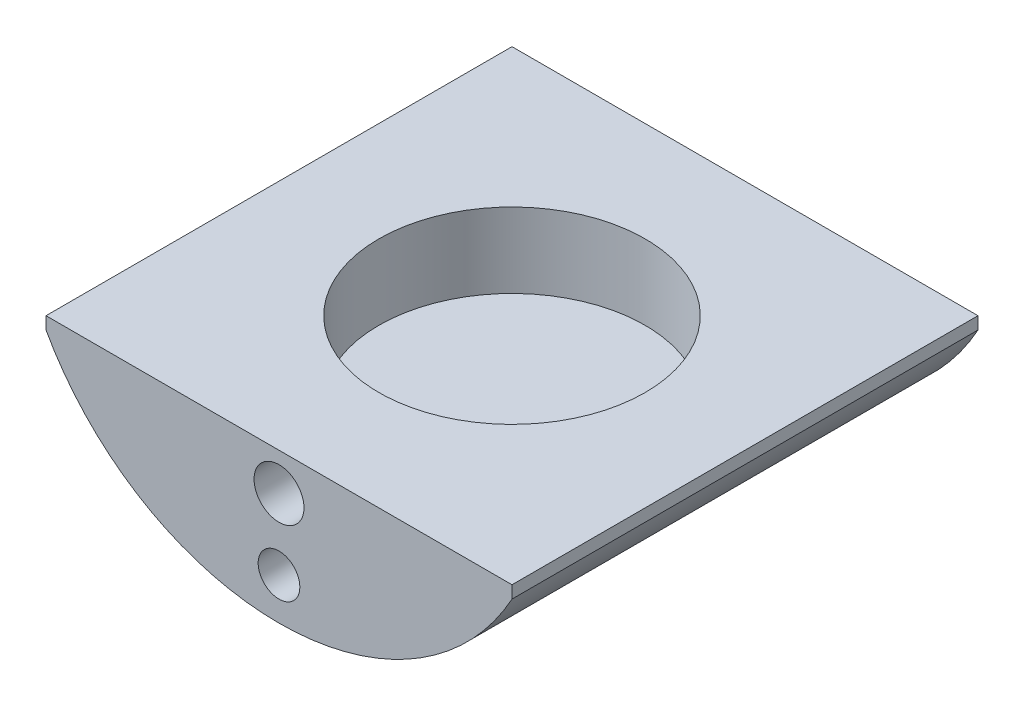
ISO-10303-21;
HEADER;
FILE_DESCRIPTION(('STEP AP214'),'2;1');
FILE_NAME('part.step','',(''),(''),'','','');
FILE_SCHEMA(('AUTOMOTIVE_DESIGN { 1 0 10303 214 1 1 1 1 }'));
ENDSEC;
DATA;
#1=APPLICATION_CONTEXT('core data for automotive mechanical design processes');
#2=APPLICATION_PROTOCOL_DEFINITION('international standard','automotive_design',2000,#1);
#3=PRODUCT_CONTEXT('',#1,'mechanical');
#4=PRODUCT('Part','Part','',(#3));
#5=PRODUCT_RELATED_PRODUCT_CATEGORY('part','',(#4));
#6=PRODUCT_DEFINITION_FORMATION('','',#4);
#7=PRODUCT_DEFINITION_CONTEXT('part definition',#1,'design');
#8=PRODUCT_DEFINITION('design','',#6,#7);
#9=PRODUCT_DEFINITION_SHAPE('','',#8);
#10=(LENGTH_UNIT() NAMED_UNIT(*) SI_UNIT(.MILLI.,.METRE.));
#11=(NAMED_UNIT(*) PLANE_ANGLE_UNIT() SI_UNIT($,.RADIAN.));
#12=(NAMED_UNIT(*) SI_UNIT($,.STERADIAN.) SOLID_ANGLE_UNIT());
#13=UNCERTAINTY_MEASURE_WITH_UNIT(LENGTH_MEASURE(1.E-05),#10,'distance_accuracy_value','');
#14=(GEOMETRIC_REPRESENTATION_CONTEXT(3) GLOBAL_UNCERTAINTY_ASSIGNED_CONTEXT((#13)) GLOBAL_UNIT_ASSIGNED_CONTEXT((#10,
#11,#12)) REPRESENTATION_CONTEXT('',''));
#15=CARTESIAN_POINT('',(0.,0.,0.));
#16=DIRECTION('',(0.,0.,1.));
#17=DIRECTION('',(1.,0.,0.));
#18=AXIS2_PLACEMENT_3D('',#15,#16,#17);
#19=CARTESIAN_POINT('',(0.,22.225,-44.45));
#20=DIRECTION('',(0.,0.,1.));
#21=DIRECTION('',(1.,0.,0.));
#22=AXIS2_PLACEMENT_3D('',#19,#20,#21);
#23=PLANE('',#22);
#24=CARTESIAN_POINT('',(0.,-7.14375,-44.45));
#25=DIRECTION('',(0.,0.,1.));
#26=DIRECTION('',(1.,0.,0.));
#27=AXIS2_PLACEMENT_3D('',#24,#25,#26);
#28=CIRCLE('',#27,4.7625);
#29=CARTESIAN_POINT('',(4.7625,-7.14375,-44.45));
#30=VERTEX_POINT('',#29);
#31=EDGE_CURVE('E263',#30,#30,#28,.T.);
#32=ORIENTED_EDGE('',*,*,#31,.T.);
#33=EDGE_LOOP('',(#32));
#34=FACE_BOUND('',#33,.T.);
#35=DIRECTION('',(0.,-1.,0.));
#36=VECTOR('',#35,1.);
#37=CARTESIAN_POINT('',(-44.45,0.,-44.45));
#38=LINE('',#37,#36);
#39=CARTESIAN_POINT('',(-44.45,0.,-44.45));
#40=VERTEX_POINT('',#39);
#41=CARTESIAN_POINT('',(-44.45,-2.36844424841707,-44.45));
#42=VERTEX_POINT('',#41);
#43=EDGE_CURVE('E92',#40,#42,#38,.T.);
#44=ORIENTED_EDGE('',*,*,#43,.F.);
#45=DIRECTION('',(1.,0.,0.));
#46=VECTOR('',#45,1.);
#47=CARTESIAN_POINT('',(-44.45,0.,-44.45));
#48=LINE('',#47,#46);
#49=CARTESIAN_POINT('',(44.45,0.,-44.45));
#50=VERTEX_POINT('',#49);
#51=EDGE_CURVE('E89',#40,#50,#48,.T.);
#52=ORIENTED_EDGE('',*,*,#51,.T.);
#53=DIRECTION('',(0.,1.,0.));
#54=VECTOR('',#53,1.);
#55=CARTESIAN_POINT('',(44.45,-2.3684442484171,-44.45));
#56=LINE('',#55,#54);
#57=CARTESIAN_POINT('',(44.45,-2.3684442484171,-44.45));
#58=VERTEX_POINT('',#57);
#59=EDGE_CURVE('E81',#58,#50,#56,.T.);
#60=ORIENTED_EDGE('',*,*,#59,.F.);
#61=CARTESIAN_POINT('',(0.,22.225,-44.45));
#62=DIRECTION('',(0.,0.,1.));
#63=DIRECTION('',(1.,0.,0.));
#64=AXIS2_PLACEMENT_3D('',#61,#62,#63);
#65=CIRCLE('',#64,50.8);
#66=EDGE_CURVE('E88',#42,#58,#65,.T.);
#67=ORIENTED_EDGE('',*,*,#66,.F.);
#68=EDGE_LOOP('',(#44,#52,#60,#67));
#69=FACE_BOUND('',#68,.T.);
#70=CARTESIAN_POINT('',(0.,-20.6248,-44.4500000000301));
#71=DIRECTION('',(0.,0.,1.));
#72=DIRECTION('',(1.,0.,0.));
#73=AXIS2_PLACEMENT_3D('',#70,#71,#72);
#74=CIRCLE('',#73,3.9751);
#75=CARTESIAN_POINT('',(3.9751,-20.6248,-44.4500000000301));
#76=VERTEX_POINT('',#75);
#77=EDGE_CURVE('E264',#76,#76,#74,.T.);
#78=ORIENTED_EDGE('',*,*,#77,.T.);
#79=EDGE_LOOP('',(#78));
#80=FACE_BOUND('',#79,.T.);
#81=ADVANCED_FACE('F32',(#34,#69,#80),#23,.F.);
#82=CARTESIAN_POINT('',(-44.45,0.,-44.45));
#83=DIRECTION('',(-1.,0.,0.));
#84=DIRECTION('',(0.,-1.,0.));
#85=AXIS2_PLACEMENT_3D('',#82,#83,#84);
#86=PLANE('',#85);
#87=DIRECTION('',(0.,-1.,0.));
#88=VECTOR('',#87,1.);
#89=CARTESIAN_POINT('',(-44.45,0.,44.45));
#90=LINE('',#89,#88);
#91=CARTESIAN_POINT('',(-44.45,0.,44.45));
#92=VERTEX_POINT('',#91);
#93=CARTESIAN_POINT('',(-44.45,-2.36844424841707,44.45));
#94=VERTEX_POINT('',#93);
#95=EDGE_CURVE('E99',#92,#94,#90,.T.);
#96=ORIENTED_EDGE('',*,*,#95,.F.);
#97=DIRECTION('',(0.,0.,1.));
#98=VECTOR('',#97,1.);
#99=CARTESIAN_POINT('',(-44.45,0.,-44.45));
#100=LINE('',#99,#98);
#101=EDGE_CURVE('E11',#40,#92,#100,.T.);
#102=ORIENTED_EDGE('',*,*,#101,.F.);
#103=ORIENTED_EDGE('',*,*,#43,.T.);
#104=DIRECTION('',(0.,0.,1.));
#105=VECTOR('',#104,1.);
#106=CARTESIAN_POINT('',(-44.45,-2.36844424841707,-44.45));
#107=LINE('',#106,#105);
#108=EDGE_CURVE('E36',#42,#94,#107,.T.);
#109=ORIENTED_EDGE('',*,*,#108,.T.);
#110=EDGE_LOOP('',(#96,#102,#103,#109));
#111=FACE_BOUND('',#110,.T.);
#112=ADVANCED_FACE('F34',(#111),#86,.T.);
#113=CARTESIAN_POINT('',(-44.45,0.,-44.45));
#114=DIRECTION('',(0.,-1.,0.));
#115=DIRECTION('',(1.,0.,0.));
#116=AXIS2_PLACEMENT_3D('',#113,#114,#115);
#117=PLANE('',#116);
#118=CARTESIAN_POINT('',(0.,0.,0.));
#119=DIRECTION('',(0.,1.,0.));
#120=DIRECTION('',(-1.,0.,0.));
#121=AXIS2_PLACEMENT_3D('',#118,#119,#120);
#122=CIRCLE('',#121,25.4);
#123=CARTESIAN_POINT('',(-25.4,0.,0.));
#124=VERTEX_POINT('',#123);
#125=EDGE_CURVE('E283',#124,#124,#122,.T.);
#126=ORIENTED_EDGE('',*,*,#125,.F.);
#127=EDGE_LOOP('',(#126));
#128=FACE_BOUND('',#127,.T.);
#129=DIRECTION('',(1.,0.,0.));
#130=VECTOR('',#129,1.);
#131=CARTESIAN_POINT('',(-44.45,0.,44.45));
#132=LINE('',#131,#130);
#133=CARTESIAN_POINT('',(44.45,0.,44.45));
#134=VERTEX_POINT('',#133);
#135=EDGE_CURVE('E94',#92,#134,#132,.T.);
#136=ORIENTED_EDGE('',*,*,#135,.T.);
#137=DIRECTION('',(0.,0.,1.));
#138=VECTOR('',#137,1.);
#139=CARTESIAN_POINT('',(44.45,0.,-44.45));
#140=LINE('',#139,#138);
#141=EDGE_CURVE('E42',#50,#134,#140,.T.);
#142=ORIENTED_EDGE('',*,*,#141,.F.);
#143=ORIENTED_EDGE('',*,*,#51,.F.);
#144=ORIENTED_EDGE('',*,*,#101,.T.);
#145=EDGE_LOOP('',(#136,#142,#143,#144));
#146=FACE_BOUND('',#145,.T.);
#147=ADVANCED_FACE('F107',(#128,#146),#117,.F.);
#148=CARTESIAN_POINT('',(44.45,-2.3684442484171,-44.45));
#149=DIRECTION('',(1.,0.,0.));
#150=DIRECTION('',(0.,1.,0.));
#151=AXIS2_PLACEMENT_3D('',#148,#149,#150);
#152=PLANE('',#151);
#153=DIRECTION('',(0.,1.,0.));
#154=VECTOR('',#153,1.);
#155=CARTESIAN_POINT('',(44.45,-2.3684442484171,44.45));
#156=LINE('',#155,#154);
#157=CARTESIAN_POINT('',(44.45,-2.3684442484171,44.45));
#158=VERTEX_POINT('',#157);
#159=EDGE_CURVE('E83',#158,#134,#156,.T.);
#160=ORIENTED_EDGE('',*,*,#159,.F.);
#161=DIRECTION('',(0.,0.,1.));
#162=VECTOR('',#161,1.);
#163=CARTESIAN_POINT('',(44.45,-2.3684442484171,-44.45));
#164=LINE('',#163,#162);
#165=EDGE_CURVE('E78',#58,#158,#164,.T.);
#166=ORIENTED_EDGE('',*,*,#165,.F.);
#167=ORIENTED_EDGE('',*,*,#59,.T.);
#168=ORIENTED_EDGE('',*,*,#141,.T.);
#169=EDGE_LOOP('',(#160,#166,#167,#168));
#170=FACE_BOUND('',#169,.T.);
#171=ADVANCED_FACE('F80',(#170),#152,.T.);
#172=CARTESIAN_POINT('',(0.,22.225,-44.45));
#173=DIRECTION('',(0.,0.,1.));
#174=DIRECTION('',(1.,0.,0.));
#175=AXIS2_PLACEMENT_3D('',#172,#173,#174);
#176=CYLINDRICAL_SURFACE('',#175,50.8);
#177=CARTESIAN_POINT('',(0.,22.225,44.45));
#178=DIRECTION('',(0.,0.,1.));
#179=DIRECTION('',(1.,0.,0.));
#180=AXIS2_PLACEMENT_3D('',#177,#178,#179);
#181=CIRCLE('',#180,50.8);
#182=EDGE_CURVE('E102',#94,#158,#181,.T.);
#183=ORIENTED_EDGE('',*,*,#182,.F.);
#184=ORIENTED_EDGE('',*,*,#108,.F.);
#185=ORIENTED_EDGE('',*,*,#66,.T.);
#186=ORIENTED_EDGE('',*,*,#165,.T.);
#187=EDGE_LOOP('',(#183,#184,#185,#186));
#188=FACE_BOUND('',#187,.T.);
#189=ADVANCED_FACE('F91',(#188),#176,.T.);
#190=CARTESIAN_POINT('',(0.,22.225,44.45));
#191=DIRECTION('',(0.,0.,1.));
#192=DIRECTION('',(1.,0.,0.));
#193=AXIS2_PLACEMENT_3D('',#190,#191,#192);
#194=PLANE('',#193);
#195=CARTESIAN_POINT('',(0.,-20.6248,44.4500000000301));
#196=DIRECTION('',(0.,0.,1.));
#197=DIRECTION('',(1.,0.,0.));
#198=AXIS2_PLACEMENT_3D('',#195,#196,#197);
#199=CIRCLE('',#198,3.9751);
#200=CARTESIAN_POINT('',(3.9751,-20.6248,44.4500000000301));
#201=VERTEX_POINT('',#200);
#202=EDGE_CURVE('E272',#201,#201,#199,.T.);
#203=ORIENTED_EDGE('',*,*,#202,.F.);
#204=EDGE_LOOP('',(#203));
#205=FACE_BOUND('',#204,.T.);
#206=CARTESIAN_POINT('',(0.,-7.14375,44.45));
#207=DIRECTION('',(0.,0.,1.));
#208=DIRECTION('',(1.,0.,0.));
#209=AXIS2_PLACEMENT_3D('',#206,#207,#208);
#210=CIRCLE('',#209,4.7625);
#211=CARTESIAN_POINT('',(4.7625,-7.14375,44.45));
#212=VERTEX_POINT('',#211);
#213=EDGE_CURVE('E277',#212,#212,#210,.T.);
#214=ORIENTED_EDGE('',*,*,#213,.F.);
#215=EDGE_LOOP('',(#214));
#216=FACE_BOUND('',#215,.T.);
#217=ORIENTED_EDGE('',*,*,#95,.T.);
#218=ORIENTED_EDGE('',*,*,#182,.T.);
#219=ORIENTED_EDGE('',*,*,#159,.T.);
#220=ORIENTED_EDGE('',*,*,#135,.F.);
#221=EDGE_LOOP('',(#217,#218,#219,#220));
#222=FACE_BOUND('',#221,.T.);
#223=ADVANCED_FACE('F109',(#205,#216,#222),#194,.T.);
#224=CARTESIAN_POINT('',(0.,-14.2875,0.));
#225=DIRECTION('',(0.,1.,0.));
#226=DIRECTION('',(-1.,0.,0.));
#227=AXIS2_PLACEMENT_3D('',#224,#225,#226);
#228=CYLINDRICAL_SURFACE('',#227,25.4);
#229=CARTESIAN_POINT('',(0.,-14.2875,0.));
#230=DIRECTION('',(0.,1.,0.));
#231=DIRECTION('',(-1.,0.,0.));
#232=AXIS2_PLACEMENT_3D('',#229,#230,#231);
#233=CIRCLE('',#232,25.4);
#234=CARTESIAN_POINT('',(-25.4,-14.2875,0.));
#235=VERTEX_POINT('',#234);
#236=EDGE_CURVE('E103',#235,#235,#233,.T.);
#237=ORIENTED_EDGE('',*,*,#236,.F.);
#238=EDGE_LOOP('',(#237));
#239=FACE_BOUND('',#238,.T.);
#240=ORIENTED_EDGE('',*,*,#125,.T.);
#241=EDGE_LOOP('',(#240));
#242=FACE_BOUND('',#241,.T.);
#243=ADVANCED_FACE('F124',(#239,#242),#228,.F.);
#244=CARTESIAN_POINT('',(0.,-14.2875,0.));
#245=DIRECTION('',(0.,1.,0.));
#246=DIRECTION('',(-1.,0.,0.));
#247=AXIS2_PLACEMENT_3D('',#244,#245,#246);
#248=PLANE('',#247);
#249=ORIENTED_EDGE('',*,*,#236,.T.);
#250=EDGE_LOOP('',(#249));
#251=FACE_BOUND('',#250,.T.);
#252=ADVANCED_FACE('F148',(#251),#248,.T.);
#253=CARTESIAN_POINT('',(0.,-7.14375,30.1625));
#254=DIRECTION('',(0.,0.,1.));
#255=DIRECTION('',(1.,0.,0.));
#256=AXIS2_PLACEMENT_3D('',#253,#254,#255);
#257=CYLINDRICAL_SURFACE('',#256,4.7625);
#258=CARTESIAN_POINT('',(0.,-7.14375,30.1625));
#259=DIRECTION('',(0.,0.,1.));
#260=DIRECTION('',(1.,0.,0.));
#261=AXIS2_PLACEMENT_3D('',#258,#259,#260);
#262=CIRCLE('',#261,4.7625);
#263=CARTESIAN_POINT('',(4.7625,-7.14375,30.1625));
#264=VERTEX_POINT('',#263);
#265=EDGE_CURVE('E280',#264,#264,#262,.T.);
#266=ORIENTED_EDGE('',*,*,#265,.F.);
#267=EDGE_LOOP('',(#266));
#268=FACE_BOUND('',#267,.T.);
#269=ORIENTED_EDGE('',*,*,#213,.T.);
#270=EDGE_LOOP('',(#269));
#271=FACE_BOUND('',#270,.T.);
#272=ADVANCED_FACE('F155',(#268,#271),#257,.F.);
#273=CARTESIAN_POINT('',(0.,-7.14375,30.1625));
#274=DIRECTION('',(0.,0.,1.));
#275=DIRECTION('',(1.,0.,0.));
#276=AXIS2_PLACEMENT_3D('',#273,#274,#275);
#277=PLANE('',#276);
#278=ORIENTED_EDGE('',*,*,#265,.T.);
#279=EDGE_LOOP('',(#278));
#280=FACE_BOUND('',#279,.T.);
#281=ADVANCED_FACE('F162',(#280),#277,.T.);
#282=CARTESIAN_POINT('',(0.,-20.6248,26.9875000000301));
#283=DIRECTION('',(0.,0.,1.));
#284=DIRECTION('',(1.,0.,0.));
#285=AXIS2_PLACEMENT_3D('',#282,#283,#284);
#286=CYLINDRICAL_SURFACE('',#285,3.9751);
#287=CARTESIAN_POINT('',(0.,-20.6248,26.9875000000301));
#288=DIRECTION('',(0.,0.,1.));
#289=DIRECTION('',(1.,0.,0.));
#290=AXIS2_PLACEMENT_3D('',#287,#288,#289);
#291=CIRCLE('',#290,3.9751);
#292=CARTESIAN_POINT('',(3.9751,-20.6248,26.9875000000301));
#293=VERTEX_POINT('',#292);
#294=EDGE_CURVE('E274',#293,#293,#291,.T.);
#295=ORIENTED_EDGE('',*,*,#294,.F.);
#296=EDGE_LOOP('',(#295));
#297=FACE_BOUND('',#296,.T.);
#298=ORIENTED_EDGE('',*,*,#202,.T.);
#299=EDGE_LOOP('',(#298));
#300=FACE_BOUND('',#299,.T.);
#301=ADVANCED_FACE('F169',(#297,#300),#286,.F.);
#302=CARTESIAN_POINT('',(0.,-20.6248,26.9875000000301));
#303=DIRECTION('',(0.,0.,1.));
#304=DIRECTION('',(1.,0.,0.));
#305=AXIS2_PLACEMENT_3D('',#302,#303,#304);
#306=PLANE('',#305);
#307=ORIENTED_EDGE('',*,*,#294,.T.);
#308=EDGE_LOOP('',(#307));
#309=FACE_BOUND('',#308,.T.);
#310=ADVANCED_FACE('F176',(#309),#306,.T.);
#311=CARTESIAN_POINT('',(0.,-7.14375,-30.1625));
#312=DIRECTION('',(0.,0.,-1.));
#313=DIRECTION('',(-1.,0.,0.));
#314=AXIS2_PLACEMENT_3D('',#311,#312,#313);
#315=CYLINDRICAL_SURFACE('',#314,4.7625);
#316=CARTESIAN_POINT('',(0.,-7.14375,-30.1625));
#317=DIRECTION('',(0.,0.,1.));
#318=DIRECTION('',(1.,0.,0.));
#319=AXIS2_PLACEMENT_3D('',#316,#317,#318);
#320=CIRCLE('',#319,4.7625);
#321=CARTESIAN_POINT('',(4.7625,-7.14375,-30.1625));
#322=VERTEX_POINT('',#321);
#323=EDGE_CURVE('E266',#322,#322,#320,.T.);
#324=ORIENTED_EDGE('',*,*,#323,.T.);
#325=EDGE_LOOP('',(#324));
#326=FACE_BOUND('',#325,.T.);
#327=ORIENTED_EDGE('',*,*,#31,.F.);
#328=EDGE_LOOP('',(#327));
#329=FACE_BOUND('',#328,.T.);
#330=ADVANCED_FACE('F184',(#326,#329),#315,.F.);
#331=CARTESIAN_POINT('',(0.,-7.14375,-30.1625));
#332=DIRECTION('',(0.,0.,-1.));
#333=DIRECTION('',(1.,0.,0.));
#334=AXIS2_PLACEMENT_3D('',#331,#332,#333);
#335=PLANE('',#334);
#336=ORIENTED_EDGE('',*,*,#323,.F.);
#337=EDGE_LOOP('',(#336));
#338=FACE_BOUND('',#337,.T.);
#339=ADVANCED_FACE('F192',(#338),#335,.T.);
#340=CARTESIAN_POINT('',(0.,-20.6248,-26.9875000000301));
#341=DIRECTION('',(0.,0.,-1.));
#342=DIRECTION('',(-1.,0.,0.));
#343=AXIS2_PLACEMENT_3D('',#340,#341,#342);
#344=CYLINDRICAL_SURFACE('',#343,3.9751);
#345=CARTESIAN_POINT('',(0.,-20.6248,-26.9875000000301));
#346=DIRECTION('',(0.,0.,1.));
#347=DIRECTION('',(1.,0.,0.));
#348=AXIS2_PLACEMENT_3D('',#345,#346,#347);
#349=CIRCLE('',#348,3.9751);
#350=CARTESIAN_POINT('',(3.9751,-20.6248,-26.9875000000301));
#351=VERTEX_POINT('',#350);
#352=EDGE_CURVE('E262',#351,#351,#349,.T.);
#353=ORIENTED_EDGE('',*,*,#352,.T.);
#354=EDGE_LOOP('',(#353));
#355=FACE_BOUND('',#354,.T.);
#356=ORIENTED_EDGE('',*,*,#77,.F.);
#357=EDGE_LOOP('',(#356));
#358=FACE_BOUND('',#357,.T.);
#359=ADVANCED_FACE('F200',(#355,#358),#344,.F.);
#360=CARTESIAN_POINT('',(0.,-20.6248,-26.9875000000301));
#361=DIRECTION('',(0.,0.,-1.));
#362=DIRECTION('',(1.,0.,0.));
#363=AXIS2_PLACEMENT_3D('',#360,#361,#362);
#364=PLANE('',#363);
#365=ORIENTED_EDGE('',*,*,#352,.F.);
#366=EDGE_LOOP('',(#365));
#367=FACE_BOUND('',#366,.T.);
#368=ADVANCED_FACE('F208',(#367),#364,.T.);
#369=CLOSED_SHELL('',(#81,#112,#147,#171,#189,#223,#243,#252,#272,#281,#301,#310,#330,#339,#359,#368));
#370=MANIFOLD_SOLID_BREP('B2',#369);
#371=ADVANCED_BREP_SHAPE_REPRESENTATION('',(#18,#370),#14);
#372=SHAPE_DEFINITION_REPRESENTATION(#9,#371);
ENDSEC;
END-ISO-10303-21;
